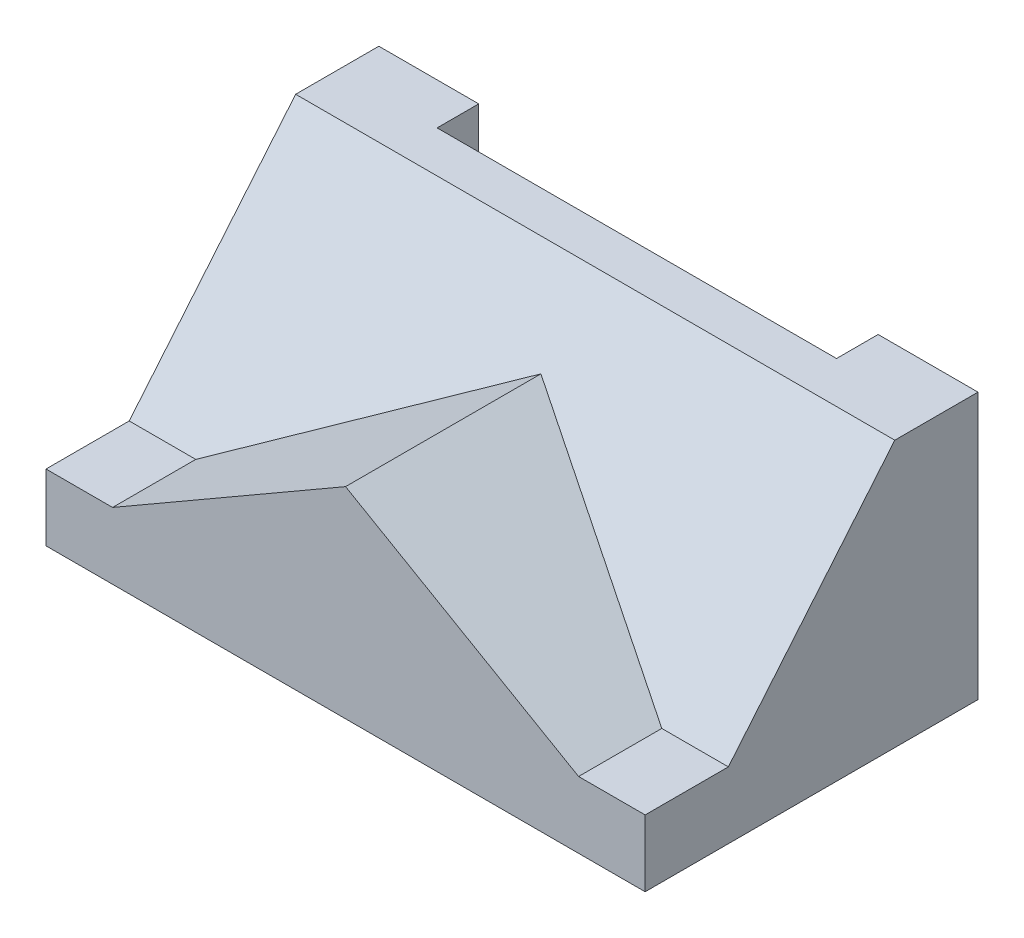
ISO-10303-21;
HEADER;
FILE_DESCRIPTION(('STEP AP214'),'2;1');
FILE_NAME('part.step','',(''),(''),'','','');
FILE_SCHEMA(('AUTOMOTIVE_DESIGN { 1 0 10303 214 1 1 1 1 }'));
ENDSEC;
DATA;
#1=APPLICATION_CONTEXT('core data for automotive mechanical design processes');
#2=APPLICATION_PROTOCOL_DEFINITION('international standard','automotive_design',2000,#1);
#3=PRODUCT_CONTEXT('',#1,'mechanical');
#4=PRODUCT('Part','Part','',(#3));
#5=PRODUCT_RELATED_PRODUCT_CATEGORY('part','',(#4));
#6=PRODUCT_DEFINITION_FORMATION('','',#4);
#7=PRODUCT_DEFINITION_CONTEXT('part definition',#1,'design');
#8=PRODUCT_DEFINITION('design','',#6,#7);
#9=PRODUCT_DEFINITION_SHAPE('','',#8);
#10=(LENGTH_UNIT() NAMED_UNIT(*) SI_UNIT(.MILLI.,.METRE.));
#11=(NAMED_UNIT(*) PLANE_ANGLE_UNIT() SI_UNIT($,.RADIAN.));
#12=(NAMED_UNIT(*) SI_UNIT($,.STERADIAN.) SOLID_ANGLE_UNIT());
#13=UNCERTAINTY_MEASURE_WITH_UNIT(LENGTH_MEASURE(1.E-05),#10,'distance_accuracy_value','');
#14=(GEOMETRIC_REPRESENTATION_CONTEXT(3) GLOBAL_UNCERTAINTY_ASSIGNED_CONTEXT((#13)) GLOBAL_UNIT_ASSIGNED_CONTEXT((#10,
#11,#12)) REPRESENTATION_CONTEXT('',''));
#15=CARTESIAN_POINT('',(0.,0.,0.));
#16=DIRECTION('',(0.,0.,1.));
#17=DIRECTION('',(1.,0.,0.));
#18=AXIS2_PLACEMENT_3D('',#15,#16,#17);
#19=CARTESIAN_POINT('',(36.,0.,-40.));
#20=DIRECTION('',(0.,0.,1.));
#21=DIRECTION('',(1.,0.,0.));
#22=AXIS2_PLACEMENT_3D('',#19,#20,#21);
#23=PLANE('',#22);
#24=DIRECTION('',(-1.,0.,0.));
#25=VECTOR('',#24,1.);
#26=CARTESIAN_POINT('',(36.,32.,-40.));
#27=LINE('',#26,#25);
#28=CARTESIAN_POINT('',(-24.,32.,-40.));
#29=VERTEX_POINT('',#28);
#30=CARTESIAN_POINT('',(-36.,32.,-40.));
#31=VERTEX_POINT('',#30);
#32=EDGE_CURVE('E216',#29,#31,#27,.T.);
#33=ORIENTED_EDGE('',*,*,#32,.F.);
#34=DIRECTION('',(0.,1.,0.));
#35=VECTOR('',#34,1.);
#36=CARTESIAN_POINT('',(-24.,0.,-40.));
#37=LINE('',#36,#35);
#38=CARTESIAN_POINT('',(-24.,0.,-40.));
#39=VERTEX_POINT('',#38);
#40=EDGE_CURVE('E155',#39,#29,#37,.T.);
#41=ORIENTED_EDGE('',*,*,#40,.F.);
#42=DIRECTION('',(-1.,0.,0.));
#43=VECTOR('',#42,1.);
#44=CARTESIAN_POINT('',(36.,0.,-40.));
#45=LINE('',#44,#43);
#46=CARTESIAN_POINT('',(-36.,0.,-40.));
#47=VERTEX_POINT('',#46);
#48=EDGE_CURVE('E146',#39,#47,#45,.T.);
#49=ORIENTED_EDGE('',*,*,#48,.T.);
#50=DIRECTION('',(0.,1.,0.));
#51=VECTOR('',#50,1.);
#52=CARTESIAN_POINT('',(-36.,0.,-40.));
#53=LINE('',#52,#51);
#54=EDGE_CURVE('E196',#47,#31,#53,.T.);
#55=ORIENTED_EDGE('',*,*,#54,.T.);
#56=EDGE_LOOP('',(#33,#41,#49,#55));
#57=FACE_BOUND('',#56,.T.);
#58=ADVANCED_FACE('F31',(#57),#23,.F.);
#59=CARTESIAN_POINT('',(36.,8.,-10.));
#60=DIRECTION('',(0.,-1.,0.));
#61=DIRECTION('',(0.,0.,-1.));
#62=AXIS2_PLACEMENT_3D('',#59,#60,#61);
#63=PLANE('',#62);
#64=DIRECTION('',(0.,0.,1.));
#65=VECTOR('',#64,1.);
#66=CARTESIAN_POINT('',(28.,8.,-500000.));
#67=LINE('',#66,#65);
#68=CARTESIAN_POINT('',(28.,8.,-10.0000000001046));
#69=VERTEX_POINT('',#68);
#70=CARTESIAN_POINT('',(28.,8.,0.));
#71=VERTEX_POINT('',#70);
#72=EDGE_CURVE('E164',#69,#71,#67,.T.);
#73=ORIENTED_EDGE('',*,*,#72,.T.);
#74=DIRECTION('',(-1.,0.,0.));
#75=VECTOR('',#74,1.);
#76=CARTESIAN_POINT('',(36.,8.,0.));
#77=LINE('',#76,#75);
#78=CARTESIAN_POINT('',(36.,8.,0.));
#79=VERTEX_POINT('',#78);
#80=EDGE_CURVE('E206',#79,#71,#77,.T.);
#81=ORIENTED_EDGE('',*,*,#80,.F.);
#82=DIRECTION('',(0.,0.,1.));
#83=VECTOR('',#82,1.);
#84=CARTESIAN_POINT('',(36.,8.,-10.));
#85=LINE('',#84,#83);
#86=CARTESIAN_POINT('',(36.,8.,-10.));
#87=VERTEX_POINT('',#86);
#88=EDGE_CURVE('E189',#87,#79,#85,.T.);
#89=ORIENTED_EDGE('',*,*,#88,.F.);
#90=DIRECTION('',(-1.,0.,0.));
#91=VECTOR('',#90,1.);
#92=CARTESIAN_POINT('',(36.,8.,-10.));
#93=LINE('',#92,#91);
#94=EDGE_CURVE('E210',#87,#69,#93,.T.);
#95=ORIENTED_EDGE('',*,*,#94,.T.);
#96=EDGE_LOOP('',(#73,#81,#89,#95));
#97=FACE_BOUND('',#96,.T.);
#98=ADVANCED_FACE('F263',(#97),#63,.F.);
#99=CARTESIAN_POINT('',(36.,8.,0.));
#100=DIRECTION('',(0.,0.,-1.));
#101=DIRECTION('',(0.,1.,0.));
#102=AXIS2_PLACEMENT_3D('',#99,#100,#101);
#103=PLANE('',#102);
#104=DIRECTION('',(0.,-1.,0.));
#105=VECTOR('',#104,1.);
#106=CARTESIAN_POINT('',(-36.,8.,0.));
#107=LINE('',#106,#105);
#108=CARTESIAN_POINT('',(-36.,8.,0.));
#109=VERTEX_POINT('',#108);
#110=CARTESIAN_POINT('',(-36.,0.,0.));
#111=VERTEX_POINT('',#110);
#112=EDGE_CURVE('E167',#109,#111,#107,.T.);
#113=ORIENTED_EDGE('',*,*,#112,.T.);
#114=DIRECTION('',(-1.,0.,0.));
#115=VECTOR('',#114,1.);
#116=CARTESIAN_POINT('',(36.,0.,0.));
#117=LINE('',#116,#115);
#118=CARTESIAN_POINT('',(36.,0.,0.));
#119=VERTEX_POINT('',#118);
#120=EDGE_CURVE('E11',#119,#111,#117,.T.);
#121=ORIENTED_EDGE('',*,*,#120,.F.);
#122=DIRECTION('',(0.,-1.,0.));
#123=VECTOR('',#122,1.);
#124=CARTESIAN_POINT('',(36.,8.,0.));
#125=LINE('',#124,#123);
#126=EDGE_CURVE('E177',#79,#119,#125,.T.);
#127=ORIENTED_EDGE('',*,*,#126,.F.);
#128=ORIENTED_EDGE('',*,*,#80,.T.);
#129=DIRECTION('',(0.86602540378444,-0.499999999999998,0.));
#130=VECTOR('',#129,1.);
#131=CARTESIAN_POINT('',(0.,24.1658075373094,0.));
#132=LINE('',#131,#130);
#133=CARTESIAN_POINT('',(0.,24.1658075373094,0.));
#134=VERTEX_POINT('',#133);
#135=EDGE_CURVE('E165',#134,#71,#132,.T.);
#136=ORIENTED_EDGE('',*,*,#135,.F.);
#137=DIRECTION('',(-0.86602540378444,-0.499999999999998,0.));
#138=VECTOR('',#137,1.);
#139=CARTESIAN_POINT('',(0.,24.1658075373094,0.));
#140=LINE('',#139,#138);
#141=CARTESIAN_POINT('',(-28.,8.,0.));
#142=VERTEX_POINT('',#141);
#143=EDGE_CURVE('E54',#134,#142,#140,.T.);
#144=ORIENTED_EDGE('',*,*,#143,.T.);
#145=EDGE_CURVE('E191',#142,#109,#77,.T.);
#146=ORIENTED_EDGE('',*,*,#145,.T.);
#147=EDGE_LOOP('',(#113,#121,#127,#128,#136,#144,#146));
#148=FACE_BOUND('',#147,.T.);
#149=ADVANCED_FACE('F33',(#148),#103,.F.);
#150=CARTESIAN_POINT('',(36.,0.,0.));
#151=DIRECTION('',(0.,1.,0.));
#152=DIRECTION('',(0.,0.,1.));
#153=AXIS2_PLACEMENT_3D('',#150,#151,#152);
#154=PLANE('',#153);
#155=ORIENTED_EDGE('',*,*,#48,.F.);
#156=DIRECTION('',(0.,0.,1.));
#157=VECTOR('',#156,1.);
#158=CARTESIAN_POINT('',(-24.,0.,-35.));
#159=LINE('',#158,#157);
#160=CARTESIAN_POINT('',(-24.,0.,-35.));
#161=VERTEX_POINT('',#160);
#162=EDGE_CURVE('E128',#39,#161,#159,.T.);
#163=ORIENTED_EDGE('',*,*,#162,.T.);
#164=DIRECTION('',(1.,0.,0.));
#165=VECTOR('',#164,1.);
#166=CARTESIAN_POINT('',(-24.,0.,-35.));
#167=LINE('',#166,#165);
#168=CARTESIAN_POINT('',(24.,0.,-35.));
#169=VERTEX_POINT('',#168);
#170=EDGE_CURVE('E137',#161,#169,#167,.T.);
#171=ORIENTED_EDGE('',*,*,#170,.T.);
#172=DIRECTION('',(0.,0.,-1.));
#173=VECTOR('',#172,1.);
#174=CARTESIAN_POINT('',(24.,0.,-35.));
#175=LINE('',#174,#173);
#176=CARTESIAN_POINT('',(24.,0.,-40.));
#177=VERTEX_POINT('',#176);
#178=EDGE_CURVE('E134',#169,#177,#175,.T.);
#179=ORIENTED_EDGE('',*,*,#178,.T.);
#180=CARTESIAN_POINT('',(36.,0.,-40.));
#181=VERTEX_POINT('',#180);
#182=EDGE_CURVE('E39',#181,#177,#45,.T.);
#183=ORIENTED_EDGE('',*,*,#182,.F.);
#184=DIRECTION('',(0.,0.,-1.));
#185=VECTOR('',#184,1.);
#186=CARTESIAN_POINT('',(36.,0.,0.));
#187=LINE('',#186,#185);
#188=EDGE_CURVE('E180',#119,#181,#187,.T.);
#189=ORIENTED_EDGE('',*,*,#188,.F.);
#190=ORIENTED_EDGE('',*,*,#120,.T.);
#191=DIRECTION('',(0.,0.,-1.));
#192=VECTOR('',#191,1.);
#193=CARTESIAN_POINT('',(-36.,0.,0.));
#194=LINE('',#193,#192);
#195=EDGE_CURVE('E194',#111,#47,#194,.T.);
#196=ORIENTED_EDGE('',*,*,#195,.T.);
#197=EDGE_LOOP('',(#155,#163,#171,#179,#183,#189,#190,#196));
#198=FACE_BOUND('',#197,.T.);
#199=ADVANCED_FACE('F144',(#198),#154,.F.);
#200=ORIENTED_EDGE('',*,*,#182,.T.);
#201=DIRECTION('',(0.,1.,0.));
#202=VECTOR('',#201,1.);
#203=CARTESIAN_POINT('',(24.,0.,-40.));
#204=LINE('',#203,#202);
#205=CARTESIAN_POINT('',(24.,32.,-40.));
#206=VERTEX_POINT('',#205);
#207=EDGE_CURVE('E158',#177,#206,#204,.T.);
#208=ORIENTED_EDGE('',*,*,#207,.T.);
#209=CARTESIAN_POINT('',(36.,32.,-40.));
#210=VERTEX_POINT('',#209);
#211=EDGE_CURVE('E217',#210,#206,#27,.T.);
#212=ORIENTED_EDGE('',*,*,#211,.F.);
#213=DIRECTION('',(0.,1.,0.));
#214=VECTOR('',#213,1.);
#215=CARTESIAN_POINT('',(36.,0.,-40.));
#216=LINE('',#215,#214);
#217=EDGE_CURVE('E183',#181,#210,#216,.T.);
#218=ORIENTED_EDGE('',*,*,#217,.F.);
#219=EDGE_LOOP('',(#200,#208,#212,#218));
#220=FACE_BOUND('',#219,.T.);
#221=ADVANCED_FACE('F248',(#220),#23,.F.);
#222=CARTESIAN_POINT('',(36.,32.,-40.));
#223=DIRECTION('',(0.,-1.,0.));
#224=DIRECTION('',(0.,0.,-1.));
#225=AXIS2_PLACEMENT_3D('',#222,#223,#224);
#226=PLANE('',#225);
#227=DIRECTION('',(1.,0.,0.));
#228=VECTOR('',#227,1.);
#229=CARTESIAN_POINT('',(-24.,32.,-35.));
#230=LINE('',#229,#228);
#231=CARTESIAN_POINT('',(-24.,32.,-35.));
#232=VERTEX_POINT('',#231);
#233=CARTESIAN_POINT('',(24.,32.,-35.));
#234=VERTEX_POINT('',#233);
#235=EDGE_CURVE('E149',#232,#234,#230,.T.);
#236=ORIENTED_EDGE('',*,*,#235,.F.);
#237=DIRECTION('',(0.,0.,1.));
#238=VECTOR('',#237,1.);
#239=CARTESIAN_POINT('',(-24.,32.,-35.));
#240=LINE('',#239,#238);
#241=EDGE_CURVE('E46',#29,#232,#240,.T.);
#242=ORIENTED_EDGE('',*,*,#241,.F.);
#243=ORIENTED_EDGE('',*,*,#32,.T.);
#244=DIRECTION('',(0.,0.,1.));
#245=VECTOR('',#244,1.);
#246=CARTESIAN_POINT('',(-36.,32.,-40.));
#247=LINE('',#246,#245);
#248=CARTESIAN_POINT('',(-36.,32.,-30.));
#249=VERTEX_POINT('',#248);
#250=EDGE_CURVE('E199',#31,#249,#247,.T.);
#251=ORIENTED_EDGE('',*,*,#250,.T.);
#252=DIRECTION('',(-1.,0.,0.));
#253=VECTOR('',#252,1.);
#254=CARTESIAN_POINT('',(36.,32.,-30.));
#255=LINE('',#254,#253);
#256=CARTESIAN_POINT('',(36.,32.,-30.));
#257=VERTEX_POINT('',#256);
#258=EDGE_CURVE('E213',#257,#249,#255,.T.);
#259=ORIENTED_EDGE('',*,*,#258,.F.);
#260=DIRECTION('',(0.,0.,1.));
#261=VECTOR('',#260,1.);
#262=CARTESIAN_POINT('',(36.,32.,-40.));
#263=LINE('',#262,#261);
#264=EDGE_CURVE('E185',#210,#257,#263,.T.);
#265=ORIENTED_EDGE('',*,*,#264,.F.);
#266=ORIENTED_EDGE('',*,*,#211,.T.);
#267=DIRECTION('',(0.,0.,-1.));
#268=VECTOR('',#267,1.);
#269=CARTESIAN_POINT('',(24.,32.,-35.));
#270=LINE('',#269,#268);
#271=EDGE_CURVE('E147',#234,#206,#270,.T.);
#272=ORIENTED_EDGE('',*,*,#271,.F.);
#273=EDGE_LOOP('',(#236,#242,#243,#251,#259,#265,#266,#272));
#274=FACE_BOUND('',#273,.T.);
#275=ADVANCED_FACE('F235',(#274),#226,.F.);
#276=CARTESIAN_POINT('',(36.,32.,-30.));
#277=DIRECTION('',(0.,-0.64018439966448,-0.768221279597376));
#278=DIRECTION('',(0.,0.768221279597376,-0.64018439966448));
#279=AXIS2_PLACEMENT_3D('',#276,#277,#278);
#280=PLANE('',#279);
#281=CARTESIAN_POINT('',(-28.,8.,-10.0000000001046));
#282=VERTEX_POINT('',#281);
#283=CARTESIAN_POINT('',(-36.,8.,-10.));
#284=VERTEX_POINT('',#283);
#285=EDGE_CURVE('E209',#282,#284,#93,.T.);
#286=ORIENTED_EDGE('',*,*,#285,.F.);
#287=DIRECTION('',(-0.799408065031791,-0.46153846153846,0.384615384615383));
#288=VECTOR('',#287,1.);
#289=CARTESIAN_POINT('',(153725.103540182,88777.3957176642,-73984.4964313868));
#290=LINE('',#289,#288);
#291=CARTESIAN_POINT('',(0.,24.1658075373123,-23.4715062810764));
#292=VERTEX_POINT('',#291);
#293=EDGE_CURVE('E162',#292,#282,#290,.T.);
#294=ORIENTED_EDGE('',*,*,#293,.F.);
#295=DIRECTION('',(0.799408065031791,-0.46153846153846,0.384615384615383));
#296=VECTOR('',#295,1.);
#297=CARTESIAN_POINT('',(-153725.103540182,88777.3957176642,-73984.4964313868));
#298=LINE('',#297,#296);
#299=EDGE_CURVE('E157',#292,#69,#298,.T.);
#300=ORIENTED_EDGE('',*,*,#299,.T.);
#301=ORIENTED_EDGE('',*,*,#94,.F.);
#302=DIRECTION('',(0.,-0.768221279597376,0.64018439966448));
#303=VECTOR('',#302,1.);
#304=CARTESIAN_POINT('',(36.,32.,-30.));
#305=LINE('',#304,#303);
#306=EDGE_CURVE('E187',#257,#87,#305,.T.);
#307=ORIENTED_EDGE('',*,*,#306,.F.);
#308=ORIENTED_EDGE('',*,*,#258,.T.);
#309=DIRECTION('',(0.,-0.768221279597376,0.64018439966448));
#310=VECTOR('',#309,1.);
#311=CARTESIAN_POINT('',(-36.,32.,-30.));
#312=LINE('',#311,#310);
#313=EDGE_CURVE('E201',#249,#284,#312,.T.);
#314=ORIENTED_EDGE('',*,*,#313,.T.);
#315=EDGE_LOOP('',(#286,#294,#300,#301,#307,#308,#314));
#316=FACE_BOUND('',#315,.T.);
#317=ADVANCED_FACE('F240',(#316),#280,.F.);
#318=ORIENTED_EDGE('',*,*,#145,.F.);
#319=DIRECTION('',(0.,0.,1.));
#320=VECTOR('',#319,1.);
#321=CARTESIAN_POINT('',(-28.,8.,-500000.));
#322=LINE('',#321,#320);
#323=EDGE_CURVE('E172',#282,#142,#322,.T.);
#324=ORIENTED_EDGE('',*,*,#323,.F.);
#325=ORIENTED_EDGE('',*,*,#285,.T.);
#326=DIRECTION('',(0.,0.,1.));
#327=VECTOR('',#326,1.);
#328=CARTESIAN_POINT('',(-36.,8.,-10.));
#329=LINE('',#328,#327);
#330=EDGE_CURVE('E181',#284,#109,#329,.T.);
#331=ORIENTED_EDGE('',*,*,#330,.T.);
#332=EDGE_LOOP('',(#318,#324,#325,#331));
#333=FACE_BOUND('',#332,.T.);
#334=ADVANCED_FACE('F254',(#333),#63,.F.);
#335=CARTESIAN_POINT('',(36.,0.,0.));
#336=DIRECTION('',(1.,0.,0.));
#337=DIRECTION('',(0.,0.,-1.));
#338=AXIS2_PLACEMENT_3D('',#335,#336,#337);
#339=PLANE('',#338);
#340=ORIENTED_EDGE('',*,*,#126,.T.);
#341=ORIENTED_EDGE('',*,*,#188,.T.);
#342=ORIENTED_EDGE('',*,*,#217,.T.);
#343=ORIENTED_EDGE('',*,*,#264,.T.);
#344=ORIENTED_EDGE('',*,*,#306,.T.);
#345=ORIENTED_EDGE('',*,*,#88,.T.);
#346=EDGE_LOOP('',(#340,#341,#342,#343,#344,#345));
#347=FACE_BOUND('',#346,.T.);
#348=ADVANCED_FACE('F244',(#347),#339,.T.);
#349=CARTESIAN_POINT('',(-36.,0.,0.));
#350=DIRECTION('',(1.,0.,0.));
#351=DIRECTION('',(0.,0.,-1.));
#352=AXIS2_PLACEMENT_3D('',#349,#350,#351);
#353=PLANE('',#352);
#354=ORIENTED_EDGE('',*,*,#112,.F.);
#355=ORIENTED_EDGE('',*,*,#330,.F.);
#356=ORIENTED_EDGE('',*,*,#313,.F.);
#357=ORIENTED_EDGE('',*,*,#250,.F.);
#358=ORIENTED_EDGE('',*,*,#54,.F.);
#359=ORIENTED_EDGE('',*,*,#195,.F.);
#360=EDGE_LOOP('',(#354,#355,#356,#357,#358,#359));
#361=FACE_BOUND('',#360,.T.);
#362=ADVANCED_FACE('F230',(#361),#353,.F.);
#363=CARTESIAN_POINT('',(0.,24.1658075373094,-500000.));
#364=DIRECTION('',(-0.499999999999998,0.86602540378444,0.));
#365=DIRECTION('',(-0.86602540378444,-0.499999999999998,0.));
#366=AXIS2_PLACEMENT_3D('',#363,#364,#365);
#367=PLANE('',#366);
#368=DIRECTION('',(0.,0.,1.));
#369=VECTOR('',#368,1.);
#370=CARTESIAN_POINT('',(0.,24.1658075373094,-500000.));
#371=LINE('',#370,#369);
#372=EDGE_CURVE('E169',#292,#134,#371,.T.);
#373=ORIENTED_EDGE('',*,*,#372,.F.);
#374=ORIENTED_EDGE('',*,*,#293,.T.);
#375=ORIENTED_EDGE('',*,*,#323,.T.);
#376=ORIENTED_EDGE('',*,*,#143,.F.);
#377=EDGE_LOOP('',(#373,#374,#375,#376));
#378=FACE_BOUND('',#377,.T.);
#379=ADVANCED_FACE('F259',(#378),#367,.T.);
#380=CARTESIAN_POINT('',(0.,24.1658075373094,-500000.));
#381=DIRECTION('',(-0.499999999999998,-0.86602540378444,0.));
#382=DIRECTION('',(0.86602540378444,-0.499999999999998,0.));
#383=AXIS2_PLACEMENT_3D('',#380,#381,#382);
#384=PLANE('',#383);
#385=ORIENTED_EDGE('',*,*,#299,.F.);
#386=ORIENTED_EDGE('',*,*,#372,.T.);
#387=ORIENTED_EDGE('',*,*,#135,.T.);
#388=ORIENTED_EDGE('',*,*,#72,.F.);
#389=EDGE_LOOP('',(#385,#386,#387,#388));
#390=FACE_BOUND('',#389,.T.);
#391=ADVANCED_FACE('F261',(#390),#384,.F.);
#392=CARTESIAN_POINT('',(-24.,0.,-35.));
#393=DIRECTION('',(-1.,0.,0.));
#394=DIRECTION('',(0.,0.,1.));
#395=AXIS2_PLACEMENT_3D('',#392,#393,#394);
#396=PLANE('',#395);
#397=ORIENTED_EDGE('',*,*,#241,.T.);
#398=DIRECTION('',(0.,1.,0.));
#399=VECTOR('',#398,1.);
#400=CARTESIAN_POINT('',(-24.,0.,-35.));
#401=LINE('',#400,#399);
#402=EDGE_CURVE('E124',#161,#232,#401,.T.);
#403=ORIENTED_EDGE('',*,*,#402,.F.);
#404=ORIENTED_EDGE('',*,*,#162,.F.);
#405=ORIENTED_EDGE('',*,*,#40,.T.);
#406=EDGE_LOOP('',(#397,#403,#404,#405));
#407=FACE_BOUND('',#406,.T.);
#408=ADVANCED_FACE('F126',(#407),#396,.F.);
#409=CARTESIAN_POINT('',(24.,0.,-35.));
#410=DIRECTION('',(1.,0.,0.));
#411=DIRECTION('',(0.,0.,-1.));
#412=AXIS2_PLACEMENT_3D('',#409,#410,#411);
#413=PLANE('',#412);
#414=ORIENTED_EDGE('',*,*,#271,.T.);
#415=ORIENTED_EDGE('',*,*,#207,.F.);
#416=ORIENTED_EDGE('',*,*,#178,.F.);
#417=DIRECTION('',(0.,1.,0.));
#418=VECTOR('',#417,1.);
#419=CARTESIAN_POINT('',(24.,0.,-35.));
#420=LINE('',#419,#418);
#421=EDGE_CURVE('E133',#169,#234,#420,.T.);
#422=ORIENTED_EDGE('',*,*,#421,.T.);
#423=EDGE_LOOP('',(#414,#415,#416,#422));
#424=FACE_BOUND('',#423,.T.);
#425=ADVANCED_FACE('F250',(#424),#413,.F.);
#426=CARTESIAN_POINT('',(-24.,0.,-35.));
#427=DIRECTION('',(0.,0.,1.));
#428=DIRECTION('',(0.,-1.,0.));
#429=AXIS2_PLACEMENT_3D('',#426,#427,#428);
#430=PLANE('',#429);
#431=ORIENTED_EDGE('',*,*,#235,.T.);
#432=ORIENTED_EDGE('',*,*,#421,.F.);
#433=ORIENTED_EDGE('',*,*,#170,.F.);
#434=ORIENTED_EDGE('',*,*,#402,.T.);
#435=EDGE_LOOP('',(#431,#432,#433,#434));
#436=FACE_BOUND('',#435,.T.);
#437=ADVANCED_FACE('F138',(#436),#430,.F.);
#438=CLOSED_SHELL('',(#58,#98,#149,#199,#221,#275,#317,#334,#348,#362,#379,#391,#408,#425,#437));
#439=MANIFOLD_SOLID_BREP('B2',#438);
#440=ADVANCED_BREP_SHAPE_REPRESENTATION('',(#18,#439),#14);
#441=SHAPE_DEFINITION_REPRESENTATION(#9,#440);
ENDSEC;
END-ISO-10303-21;
